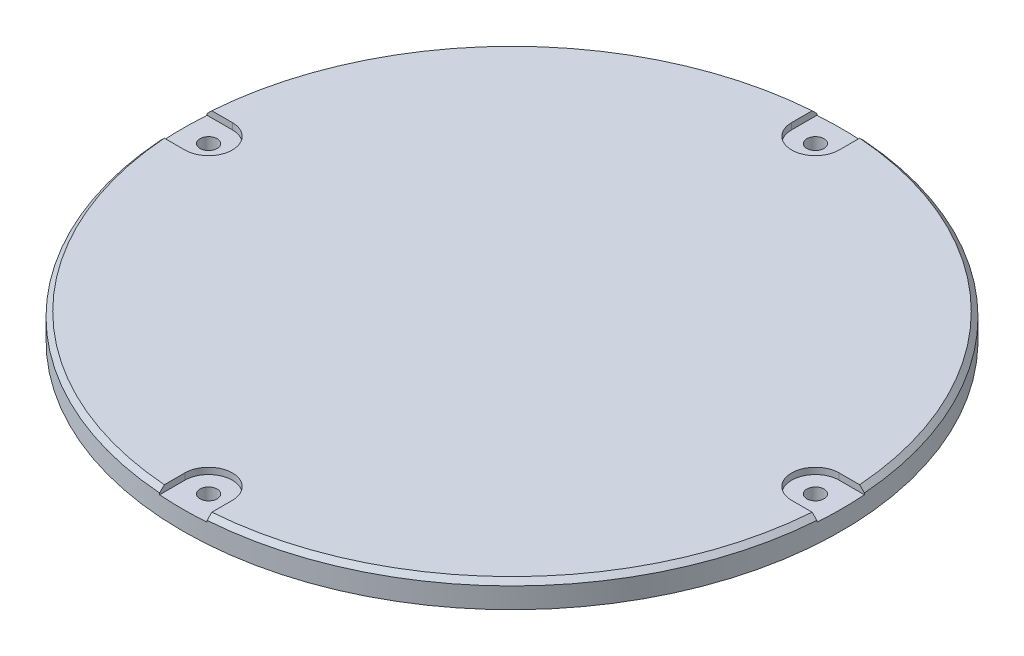
ISO-10303-21;
HEADER;
FILE_DESCRIPTION(('STEP AP214'),'2;1');
FILE_NAME('part.step','',(''),(''),'','','');
FILE_SCHEMA(('AUTOMOTIVE_DESIGN { 1 0 10303 214 1 1 1 1 }'));
ENDSEC;
DATA;
#1=APPLICATION_CONTEXT('core data for automotive mechanical design processes');
#2=APPLICATION_PROTOCOL_DEFINITION('international standard','automotive_design',2000,#1);
#3=PRODUCT_CONTEXT('',#1,'mechanical');
#4=PRODUCT('Part','Part','',(#3));
#5=PRODUCT_RELATED_PRODUCT_CATEGORY('part','',(#4));
#6=PRODUCT_DEFINITION_FORMATION('','',#4);
#7=PRODUCT_DEFINITION_CONTEXT('part definition',#1,'design');
#8=PRODUCT_DEFINITION('design','',#6,#7);
#9=PRODUCT_DEFINITION_SHAPE('','',#8);
#10=(LENGTH_UNIT() NAMED_UNIT(*) SI_UNIT(.MILLI.,.METRE.));
#11=(NAMED_UNIT(*) PLANE_ANGLE_UNIT() SI_UNIT($,.RADIAN.));
#12=(NAMED_UNIT(*) SI_UNIT($,.STERADIAN.) SOLID_ANGLE_UNIT());
#13=UNCERTAINTY_MEASURE_WITH_UNIT(LENGTH_MEASURE(1.E-05),#10,'distance_accuracy_value','');
#14=(GEOMETRIC_REPRESENTATION_CONTEXT(3) GLOBAL_UNCERTAINTY_ASSIGNED_CONTEXT((#13)) GLOBAL_UNIT_ASSIGNED_CONTEXT((#10,
#11,#12)) REPRESENTATION_CONTEXT('',''));
#15=CARTESIAN_POINT('',(0.,0.,0.));
#16=DIRECTION('',(0.,0.,1.));
#17=DIRECTION('',(1.,0.,0.));
#18=AXIS2_PLACEMENT_3D('',#15,#16,#17);
#19=CARTESIAN_POINT('',(0.,4.,0.));
#20=DIRECTION('',(0.,-1.,0.));
#21=DIRECTION('',(0.,0.,-1.));
#22=AXIS2_PLACEMENT_3D('',#19,#20,#21);
#23=CONICAL_SURFACE('',#22,51.25,0.785398163397462);
#24=CARTESIAN_POINT('',(0.,3.25000000000002,0.));
#25=DIRECTION('',(0.,1.,0.));
#26=DIRECTION('',(0.,0.,1.));
#27=AXIS2_PLACEMENT_3D('',#24,#25,#26);
#28=CIRCLE('',#27,52.);
#29=CARTESIAN_POINT('',(3.75,3.25000000000001,-51.8646073927105));
#30=VERTEX_POINT('',#29);
#31=CARTESIAN_POINT('',(51.8646073927105,3.25000000000002,-3.74999999999982));
#32=VERTEX_POINT('',#31);
#33=EDGE_CURVE('E471',#30,#32,#28,.F.);
#34=ORIENTED_EDGE('',*,*,#33,.F.);
#35=CARTESIAN_POINT('',(3.75,-0.794982563244696,-55.9193845684519));
#36=CARTESIAN_POINT('',(3.75,-0.0573468361015232,-55.1800915932133));
#37=CARTESIAN_POINT('',(3.75,0.680256548028162,-54.4407663456519));
#38=CARTESIAN_POINT('',(3.75,2.1553890839409,-52.9620418182177));
#39=CARTESIAN_POINT('',(3.75,2.89291823572493,-52.2226425383459));
#40=CARTESIAN_POINT('',(3.75,4.36789278230882,-50.7437604368944));
#41=CARTESIAN_POINT('',(3.75,5.10533817710841,-50.0042776153145));
#42=CARTESIAN_POINT('',(3.75,6.58013285408611,-48.5252161179169));
#43=CARTESIAN_POINT('',(3.75,7.31748213626294,-47.785637442098));
#44=CARTESIAN_POINT('',(3.75,8.05477717574141,-47.0460046914869));
#45=B_SPLINE_CURVE_WITH_KNOTS('',3,(#35,#36,#37,#38,#39,#40,#41,#42,#43,#44),.UNSPECIFIED.,.F.,
.F.,(4,2,2,2,4),(0.,3.13304087556219,6.2660817099244,9.39912255397924,12.5321634392833),.UNSPECIFIED.);
#46=CARTESIAN_POINT('',(3.75,4.,-51.1126207506522));
#47=VERTEX_POINT('',#46);
#48=EDGE_CURVE('E61',#30,#47,#45,.T.);
#49=ORIENTED_EDGE('',*,*,#48,.T.);
#50=CARTESIAN_POINT('',(0.,4.,0.));
#51=DIRECTION('',(0.,1.,0.));
#52=DIRECTION('',(0.,0.,1.));
#53=AXIS2_PLACEMENT_3D('',#50,#51,#52);
#54=CIRCLE('',#53,51.25);
#55=CARTESIAN_POINT('',(51.1126207506522,4.,-3.74999999999982));
#56=VERTEX_POINT('',#55);
#57=EDGE_CURVE('E344',#56,#47,#54,.T.);
#58=ORIENTED_EDGE('',*,*,#57,.F.);
#59=CARTESIAN_POINT('',(55.9193845684519,-0.794982563244682,-3.74999999999981));
#60=CARTESIAN_POINT('',(55.1800915932133,-0.0573468361015116,-3.74999999999981));
#61=CARTESIAN_POINT('',(54.4407663456519,0.68025654802817,-3.74999999999981));
#62=CARTESIAN_POINT('',(52.9620418182177,2.1553890839409,-3.74999999999982));
#63=CARTESIAN_POINT('',(52.2226425383459,2.89291823572493,-3.74999999999982));
#64=CARTESIAN_POINT('',(50.7437604368944,4.36789278230881,-3.74999999999982));
#65=CARTESIAN_POINT('',(50.0042776153145,5.1053381771084,-3.74999999999983));
#66=CARTESIAN_POINT('',(48.5252161179169,6.5801328540861,-3.74999999999983));
#67=CARTESIAN_POINT('',(47.7856374420981,7.31748213626293,-3.74999999999983));
#68=CARTESIAN_POINT('',(47.0460046914869,8.05477717574139,-3.74999999999984));
#69=B_SPLINE_CURVE_WITH_KNOTS('',3,(#59,#60,#61,#62,#63,#64,#65,#66,#67,#68),.UNSPECIFIED.,.F.,
.F.,(4,2,2,2,4),(0.,3.13304087556218,6.26608170992438,9.39912255397921,12.5321634392833),.UNSPECIFIED.);
#70=EDGE_CURVE('E469',#32,#56,#69,.T.);
#71=ORIENTED_EDGE('',*,*,#70,.F.);
#72=EDGE_LOOP('',(#34,#49,#58,#71));
#73=FACE_BOUND('',#72,.T.);
#74=ADVANCED_FACE('F46',(#73),#23,.T.);
#75=CARTESIAN_POINT('',(-3.75,-0.794982563244682,-55.9193845684519));
#76=CARTESIAN_POINT('',(-3.75,-0.0573468361015108,-55.1800915932133));
#77=CARTESIAN_POINT('',(-3.75,0.680256548028169,-54.4407663456519));
#78=CARTESIAN_POINT('',(-3.75,2.1553890839409,-52.9620418182177));
#79=CARTESIAN_POINT('',(-3.75,2.89291823572493,-52.2226425383459));
#80=CARTESIAN_POINT('',(-3.75,4.36789278230881,-50.7437604368944));
#81=CARTESIAN_POINT('',(-3.75,5.1053381771084,-50.0042776153145));
#82=CARTESIAN_POINT('',(-3.75,6.5801328540861,-48.5252161179169));
#83=CARTESIAN_POINT('',(-3.75,7.31748213626293,-47.7856374420981));
#84=CARTESIAN_POINT('',(-3.75,8.0547771757414,-47.0460046914869));
#85=B_SPLINE_CURVE_WITH_KNOTS('',3,(#75,#76,#77,#78,#79,#80,#81,#82,#83,#84),.UNSPECIFIED.,.F.,
.F.,(4,2,2,2,4),(0.,3.13304087556217,6.26608170992438,9.39912255397921,12.5321634392833),.UNSPECIFIED.);
#86=CARTESIAN_POINT('',(-3.75,3.25000000000002,-51.8646073927105));
#87=VERTEX_POINT('',#86);
#88=CARTESIAN_POINT('',(-3.75,4.,-51.1126207506522));
#89=VERTEX_POINT('',#88);
#90=EDGE_CURVE('E11',#87,#89,#85,.T.);
#91=ORIENTED_EDGE('',*,*,#90,.F.);
#92=CARTESIAN_POINT('',(-51.8646073927105,3.25000000000002,-3.74999999999999));
#93=VERTEX_POINT('',#92);
#94=EDGE_CURVE('E349',#93,#87,#28,.F.);
#95=ORIENTED_EDGE('',*,*,#94,.F.);
#96=CARTESIAN_POINT('',(-55.9193845684519,-0.794982563244695,-3.74999999999947));
#97=CARTESIAN_POINT('',(-55.1800915932134,-0.0573468361015211,-3.74999999999956));
#98=CARTESIAN_POINT('',(-54.4407663456519,0.680256548028167,-3.74999999999966));
#99=CARTESIAN_POINT('',(-52.9620418182177,2.15538908394091,-3.74999999999985));
#100=CARTESIAN_POINT('',(-52.2226425383459,2.89291823572495,-3.74999999999994));
#101=CARTESIAN_POINT('',(-50.7437604368944,4.36789278230884,-3.75000000000013));
#102=CARTESIAN_POINT('',(-50.0042776153144,5.10533817710844,-3.75000000000023));
#103=CARTESIAN_POINT('',(-48.5252161179169,6.58013285408614,-3.75000000000042));
#104=CARTESIAN_POINT('',(-47.785637442098,7.31748213626298,-3.75000000000051));
#105=CARTESIAN_POINT('',(-47.0460046914868,8.05477717574144,-3.75000000000061));
#106=B_SPLINE_CURVE_WITH_KNOTS('',3,(#96,#97,#98,#99,#100,#101,#102,#103,#104,#105),
.UNSPECIFIED.,.F.,.F.,(4,2,2,2,4),(0.,3.13304087556221,6.26608170992445,9.39912255397933,
12.5321634392834),.UNSPECIFIED.);
#107=CARTESIAN_POINT('',(-51.1126207506522,4.,-3.75000000000009));
#108=VERTEX_POINT('',#107);
#109=EDGE_CURVE('E447',#93,#108,#106,.T.);
#110=ORIENTED_EDGE('',*,*,#109,.T.);
#111=EDGE_CURVE('E460',#89,#108,#54,.T.);
#112=ORIENTED_EDGE('',*,*,#111,.F.);
#113=EDGE_LOOP('',(#91,#95,#110,#112));
#114=FACE_BOUND('',#113,.T.);
#115=ADVANCED_FACE('F425',(#114),#23,.T.);
#116=CARTESIAN_POINT('',(51.8646073927105,3.25000000000002,3.75000000000018));
#117=VERTEX_POINT('',#116);
#118=CARTESIAN_POINT('',(3.74999999999964,3.25000000000002,51.8646073927105));
#119=VERTEX_POINT('',#118);
#120=EDGE_CURVE('E343',#117,#119,#28,.F.);
#121=ORIENTED_EDGE('',*,*,#120,.F.);
#122=CARTESIAN_POINT('',(55.9193845684519,-0.794982563244674,3.75000000000019));
#123=CARTESIAN_POINT('',(55.1800915932133,-0.0573468361015063,3.75000000000019));
#124=CARTESIAN_POINT('',(54.4407663456519,0.680256548028174,3.75000000000019));
#125=CARTESIAN_POINT('',(52.9620418182177,2.15538908394091,3.75000000000018));
#126=CARTESIAN_POINT('',(52.2226425383459,2.89291823572493,3.75000000000018));
#127=CARTESIAN_POINT('',(50.7437604368944,4.36789278230881,3.75000000000018));
#128=CARTESIAN_POINT('',(50.0042776153145,5.10533817710841,3.75000000000017));
#129=CARTESIAN_POINT('',(48.5252161179169,6.5801328540861,3.75000000000017));
#130=CARTESIAN_POINT('',(47.785637442098,7.31748213626293,3.75000000000017));
#131=CARTESIAN_POINT('',(47.0460046914869,8.0547771757414,3.75000000000016));
#132=B_SPLINE_CURVE_WITH_KNOTS('',3,(#122,#123,#124,#125,#126,#127,#128,#129,#130,#131),
.UNSPECIFIED.,.F.,.F.,(4,2,2,2,4),(0.,3.13304087556218,6.26608170992437,9.39912255397921,
12.5321634392833),.UNSPECIFIED.);
#133=CARTESIAN_POINT('',(51.1126207506522,4.,3.75000000000018));
#134=VERTEX_POINT('',#133);
#135=EDGE_CURVE('E512',#117,#134,#132,.T.);
#136=ORIENTED_EDGE('',*,*,#135,.T.);
#137=CARTESIAN_POINT('',(3.74999999999964,4.,51.1126207506522));
#138=VERTEX_POINT('',#137);
#139=EDGE_CURVE('E340',#138,#134,#54,.T.);
#140=ORIENTED_EDGE('',*,*,#139,.F.);
#141=CARTESIAN_POINT('',(3.74999999999961,-0.794982563244682,55.9193845684519));
#142=CARTESIAN_POINT('',(3.74999999999962,-0.0573468361015118,55.1800915932133));
#143=CARTESIAN_POINT('',(3.74999999999962,0.680256548028169,54.4407663456519));
#144=CARTESIAN_POINT('',(3.74999999999963,2.1553890839409,52.9620418182177));
#145=CARTESIAN_POINT('',(3.74999999999964,2.89291823572493,52.2226425383459));
#146=CARTESIAN_POINT('',(3.74999999999965,4.36789278230881,50.7437604368944));
#147=CARTESIAN_POINT('',(3.74999999999965,5.1053381771084,50.0042776153145));
#148=CARTESIAN_POINT('',(3.74999999999966,6.5801328540861,48.525216117917));
#149=CARTESIAN_POINT('',(3.74999999999967,7.31748213626293,47.7856374420981));
#150=CARTESIAN_POINT('',(3.74999999999967,8.0547771757414,47.046004691487));
#151=B_SPLINE_CURVE_WITH_KNOTS('',3,(#141,#142,#143,#144,#145,#146,#147,#148,#149,#150),
.UNSPECIFIED.,.F.,.F.,(4,2,2,2,4),(0.,3.13304087556217,6.26608170992438,9.39912255397921,
12.5321634392833),.UNSPECIFIED.);
#152=EDGE_CURVE('E356',#119,#138,#151,.T.);
#153=ORIENTED_EDGE('',*,*,#152,.F.);
#154=EDGE_LOOP('',(#121,#136,#140,#153));
#155=FACE_BOUND('',#154,.T.);
#156=ADVANCED_FACE('F419',(#155),#23,.T.);
#157=CARTESIAN_POINT('',(0.,4.,0.));
#158=DIRECTION('',(0.,-1.,0.));
#159=DIRECTION('',(0.,0.,-1.));
#160=AXIS2_PLACEMENT_3D('',#157,#158,#159);
#161=CYLINDRICAL_SURFACE('',#160,52.);
#162=ORIENTED_EDGE('',*,*,#94,.T.);
#163=DIRECTION('',(0.,1.,0.));
#164=VECTOR('',#163,1.);
#165=CARTESIAN_POINT('',(-3.75,3.,-51.8646073927105));
#166=LINE('',#165,#164);
#167=CARTESIAN_POINT('',(-3.75,3.,-51.8646073927105));
#168=VERTEX_POINT('',#167);
#169=EDGE_CURVE('E227',#168,#87,#166,.T.);
#170=ORIENTED_EDGE('',*,*,#169,.F.);
#171=CARTESIAN_POINT('',(0.,3.,0.));
#172=DIRECTION('',(0.,1.,0.));
#173=DIRECTION('',(0.,0.,1.));
#174=AXIS2_PLACEMENT_3D('',#171,#172,#173);
#175=CIRCLE('',#174,52.);
#176=CARTESIAN_POINT('',(3.75,3.,-51.8646073927105));
#177=VERTEX_POINT('',#176);
#178=EDGE_CURVE('E200',#177,#168,#175,.T.);
#179=ORIENTED_EDGE('',*,*,#178,.F.);
#180=DIRECTION('',(0.,1.,0.));
#181=VECTOR('',#180,1.);
#182=CARTESIAN_POINT('',(3.75,3.,-51.8646073927105));
#183=LINE('',#182,#181);
#184=EDGE_CURVE('E230',#177,#30,#183,.T.);
#185=ORIENTED_EDGE('',*,*,#184,.T.);
#186=ORIENTED_EDGE('',*,*,#33,.T.);
#187=DIRECTION('',(0.,1.,0.));
#188=VECTOR('',#187,1.);
#189=CARTESIAN_POINT('',(51.8646073927105,3.,-3.74999999999982));
#190=LINE('',#189,#188);
#191=CARTESIAN_POINT('',(51.8646073927105,3.,-3.74999999999982));
#192=VERTEX_POINT('',#191);
#193=EDGE_CURVE('E252',#192,#32,#190,.T.);
#194=ORIENTED_EDGE('',*,*,#193,.F.);
#195=CARTESIAN_POINT('',(0.,3.,0.));
#196=DIRECTION('',(0.,1.,0.));
#197=DIRECTION('',(0.,0.,1.));
#198=AXIS2_PLACEMENT_3D('',#195,#196,#197);
#199=CIRCLE('',#198,52.);
#200=CARTESIAN_POINT('',(51.8646073927105,3.,3.75000000000018));
#201=VERTEX_POINT('',#200);
#202=EDGE_CURVE('E276',#201,#192,#199,.T.);
#203=ORIENTED_EDGE('',*,*,#202,.F.);
#204=DIRECTION('',(0.,1.,0.));
#205=VECTOR('',#204,1.);
#206=CARTESIAN_POINT('',(51.8646073927105,3.,3.75000000000018));
#207=LINE('',#206,#205);
#208=EDGE_CURVE('E289',#201,#117,#207,.T.);
#209=ORIENTED_EDGE('',*,*,#208,.T.);
#210=ORIENTED_EDGE('',*,*,#120,.T.);
#211=DIRECTION('',(0.,1.,0.));
#212=VECTOR('',#211,1.);
#213=CARTESIAN_POINT('',(3.74999999999964,3.,51.8646073927105));
#214=LINE('',#213,#212);
#215=CARTESIAN_POINT('',(3.74999999999964,3.,51.8646073927105));
#216=VERTEX_POINT('',#215);
#217=EDGE_CURVE('E283',#216,#119,#214,.T.);
#218=ORIENTED_EDGE('',*,*,#217,.F.);
#219=CARTESIAN_POINT('',(0.,3.,0.));
#220=DIRECTION('',(0.,1.,0.));
#221=DIRECTION('',(0.,0.,1.));
#222=AXIS2_PLACEMENT_3D('',#219,#220,#221);
#223=CIRCLE('',#222,52.);
#224=CARTESIAN_POINT('',(-3.75000000000036,3.,51.8646073927105));
#225=VERTEX_POINT('',#224);
#226=EDGE_CURVE('E307',#225,#216,#223,.T.);
#227=ORIENTED_EDGE('',*,*,#226,.F.);
#228=DIRECTION('',(0.,1.,0.));
#229=VECTOR('',#228,1.);
#230=CARTESIAN_POINT('',(-3.75000000000036,3.,51.8646073927105));
#231=LINE('',#230,#229);
#232=CARTESIAN_POINT('',(-3.75000000000036,3.25000000000002,51.8646073927105));
#233=VERTEX_POINT('',#232);
#234=EDGE_CURVE('E318',#225,#233,#231,.T.);
#235=ORIENTED_EDGE('',*,*,#234,.T.);
#236=CARTESIAN_POINT('',(-51.8646073927105,3.25000000000002,3.74999999999946));
#237=VERTEX_POINT('',#236);
#238=EDGE_CURVE('E345',#233,#237,#28,.F.);
#239=ORIENTED_EDGE('',*,*,#238,.T.);
#240=DIRECTION('',(0.,1.,0.));
#241=VECTOR('',#240,1.);
#242=CARTESIAN_POINT('',(-51.8646073927105,3.,3.74999999999946));
#243=LINE('',#242,#241);
#244=CARTESIAN_POINT('',(-51.8646073927105,3.,3.74999999999946));
#245=VERTEX_POINT('',#244);
#246=EDGE_CURVE('E223',#245,#237,#243,.T.);
#247=ORIENTED_EDGE('',*,*,#246,.F.);
#248=CARTESIAN_POINT('',(0.,3.,0.));
#249=DIRECTION('',(0.,1.,0.));
#250=DIRECTION('',(0.,0.,1.));
#251=AXIS2_PLACEMENT_3D('',#248,#249,#250);
#252=CIRCLE('',#251,52.);
#253=CARTESIAN_POINT('',(-51.8646073927105,3.,-3.74999999999999));
#254=VERTEX_POINT('',#253);
#255=EDGE_CURVE('E245',#254,#245,#252,.T.);
#256=ORIENTED_EDGE('',*,*,#255,.F.);
#257=DIRECTION('',(0.,1.,0.));
#258=VECTOR('',#257,1.);
#259=CARTESIAN_POINT('',(-51.8646073927105,3.,-3.74999999999999));
#260=LINE('',#259,#258);
#261=EDGE_CURVE('E257',#254,#93,#260,.T.);
#262=ORIENTED_EDGE('',*,*,#261,.T.);
#263=EDGE_LOOP('',(#162,#170,#179,#185,#186,#194,#203,#209,#210,#218,#227,#235,#239,#247,#256,#262));
#264=FACE_BOUND('',#263,.T.);
#265=CARTESIAN_POINT('',(0.,0.,0.));
#266=DIRECTION('',(0.,1.,0.));
#267=DIRECTION('',(0.,0.,1.));
#268=AXIS2_PLACEMENT_3D('',#265,#266,#267);
#269=CIRCLE('',#268,52.);
#270=CARTESIAN_POINT('',(0.,0.,52.));
#271=VERTEX_POINT('',#270);
#272=EDGE_CURVE('E328',#271,#271,#269,.T.);
#273=ORIENTED_EDGE('',*,*,#272,.T.);
#274=EDGE_LOOP('',(#273));
#275=FACE_BOUND('',#274,.T.);
#276=ADVANCED_FACE('F414',(#264,#275),#161,.T.);
#277=CARTESIAN_POINT('',(0.,4.,0.));
#278=DIRECTION('',(0.,1.,0.));
#279=DIRECTION('',(0.,0.,1.));
#280=AXIS2_PLACEMENT_3D('',#277,#278,#279);
#281=PLANE('',#280);
#282=DIRECTION('',(0.,0.,1.));
#283=VECTOR('',#282,1.);
#284=CARTESIAN_POINT('',(-3.74999999999999,4.,0.));
#285=LINE('',#284,#283);
#286=CARTESIAN_POINT('',(-3.75,4.,-47.88));
#287=VERTEX_POINT('',#286);
#288=EDGE_CURVE('E195',#89,#287,#285,.T.);
#289=ORIENTED_EDGE('',*,*,#288,.F.);
#290=ORIENTED_EDGE('',*,*,#111,.T.);
#291=DIRECTION('',(1.,0.,-1.28538913826022E-13));
#292=VECTOR('',#291,1.);
#293=CARTESIAN_POINT('',(-4.82020926848439E-13,4.,-3.75000000000666));
#294=LINE('',#293,#292);
#295=CARTESIAN_POINT('',(-47.88,4.,-3.7500000000005));
#296=VERTEX_POINT('',#295);
#297=EDGE_CURVE('E76',#108,#296,#294,.T.);
#298=ORIENTED_EDGE('',*,*,#297,.T.);
#299=CARTESIAN_POINT('',(-47.88,4.,-5.01516379511428E-13));
#300=DIRECTION('',(0.,1.,0.));
#301=DIRECTION('',(0.,0.,1.));
#302=AXIS2_PLACEMENT_3D('',#299,#300,#301);
#303=CIRCLE('',#302,3.75);
#304=CARTESIAN_POINT('',(-47.88,4.,3.7499999999995));
#305=VERTEX_POINT('',#304);
#306=EDGE_CURVE('E251',#305,#296,#303,.T.);
#307=ORIENTED_EDGE('',*,*,#306,.F.);
#308=DIRECTION('',(1.,0.,0.));
#309=VECTOR('',#308,1.);
#310=CARTESIAN_POINT('',(0.,4.,3.74999999999999));
#311=LINE('',#310,#309);
#312=CARTESIAN_POINT('',(-51.1126207506522,4.,3.74999999999946));
#313=VERTEX_POINT('',#312);
#314=EDGE_CURVE('E249',#313,#305,#311,.T.);
#315=ORIENTED_EDGE('',*,*,#314,.F.);
#316=CARTESIAN_POINT('',(-3.75000000000036,4.,51.1126207506522));
#317=VERTEX_POINT('',#316);
#318=EDGE_CURVE('E339',#313,#317,#54,.T.);
#319=ORIENTED_EDGE('',*,*,#318,.T.);
#320=DIRECTION('',(0.,0.,-1.));
#321=VECTOR('',#320,1.);
#322=CARTESIAN_POINT('',(-3.75000000000001,4.,0.));
#323=LINE('',#322,#321);
#324=CARTESIAN_POINT('',(-3.75000000000033,4.,47.88));
#325=VERTEX_POINT('',#324);
#326=EDGE_CURVE('E68',#317,#325,#323,.T.);
#327=ORIENTED_EDGE('',*,*,#326,.T.);
#328=CARTESIAN_POINT('',(-3.34344253007619E-13,4.,47.88));
#329=DIRECTION('',(0.,1.,0.));
#330=DIRECTION('',(0.,0.,1.));
#331=AXIS2_PLACEMENT_3D('',#328,#329,#330);
#332=CIRCLE('',#331,3.75);
#333=CARTESIAN_POINT('',(3.74999999999967,4.,47.88));
#334=VERTEX_POINT('',#333);
#335=EDGE_CURVE('E313',#334,#325,#332,.T.);
#336=ORIENTED_EDGE('',*,*,#335,.F.);
#337=DIRECTION('',(0.,0.,-1.));
#338=VECTOR('',#337,1.);
#339=CARTESIAN_POINT('',(3.74999999999999,4.,0.));
#340=LINE('',#339,#338);
#341=EDGE_CURVE('E311',#138,#334,#340,.T.);
#342=ORIENTED_EDGE('',*,*,#341,.F.);
#343=ORIENTED_EDGE('',*,*,#139,.T.);
#344=DIRECTION('',(-1.,0.,0.));
#345=VECTOR('',#344,1.);
#346=CARTESIAN_POINT('',(0.,4.,3.75));
#347=LINE('',#346,#345);
#348=CARTESIAN_POINT('',(47.88,4.,3.75000000000017));
#349=VERTEX_POINT('',#348);
#350=EDGE_CURVE('E268',#134,#349,#347,.T.);
#351=ORIENTED_EDGE('',*,*,#350,.T.);
#352=CARTESIAN_POINT('',(47.88,4.,1.67172126503809E-13));
#353=DIRECTION('',(0.,1.,0.));
#354=DIRECTION('',(0.,0.,1.));
#355=AXIS2_PLACEMENT_3D('',#352,#353,#354);
#356=CIRCLE('',#355,3.75);
#357=CARTESIAN_POINT('',(47.88,4.,-3.74999999999983));
#358=VERTEX_POINT('',#357);
#359=EDGE_CURVE('E282',#358,#349,#356,.T.);
#360=ORIENTED_EDGE('',*,*,#359,.F.);
#361=DIRECTION('',(-1.,0.,0.));
#362=VECTOR('',#361,1.);
#363=CARTESIAN_POINT('',(0.,4.,-3.74999999999999));
#364=LINE('',#363,#362);
#365=EDGE_CURVE('E280',#56,#358,#364,.T.);
#366=ORIENTED_EDGE('',*,*,#365,.F.);
#367=ORIENTED_EDGE('',*,*,#57,.T.);
#368=DIRECTION('',(0.,0.,1.));
#369=VECTOR('',#368,1.);
#370=CARTESIAN_POINT('',(3.75000000000001,4.,0.));
#371=LINE('',#370,#369);
#372=CARTESIAN_POINT('',(3.75,4.,-47.88));
#373=VERTEX_POINT('',#372);
#374=EDGE_CURVE('E216',#47,#373,#371,.T.);
#375=ORIENTED_EDGE('',*,*,#374,.T.);
#376=CARTESIAN_POINT('',(0.,4.,-47.88));
#377=DIRECTION('',(0.,1.,0.));
#378=DIRECTION('',(0.,0.,1.));
#379=AXIS2_PLACEMENT_3D('',#376,#377,#378);
#380=CIRCLE('',#379,3.75);
#381=EDGE_CURVE('E222',#287,#373,#380,.T.);
#382=ORIENTED_EDGE('',*,*,#381,.F.);
#383=EDGE_LOOP('',(#289,#290,#298,#307,#315,#319,#327,#336,#342,#343,#351,#360,#366,#367,#375,#382));
#384=FACE_BOUND('',#383,.T.);
#385=ADVANCED_FACE('F410',(#384),#281,.T.);
#386=CARTESIAN_POINT('',(0.,0.,0.));
#387=DIRECTION('',(0.,1.,0.));
#388=DIRECTION('',(0.,0.,1.));
#389=AXIS2_PLACEMENT_3D('',#386,#387,#388);
#390=PLANE('',#389);
#391=ORIENTED_EDGE('',*,*,#272,.F.);
#392=EDGE_LOOP('',(#391));
#393=FACE_BOUND('',#392,.T.);
#394=ADVANCED_FACE('F413',(#393),#390,.F.);
#395=CARTESIAN_POINT('',(-55.9193845684519,-0.794982563244668,3.74999999999942));
#396=CARTESIAN_POINT('',(-55.1800915932133,-0.0573468361015,3.74999999999942));
#397=CARTESIAN_POINT('',(-54.4407663456519,0.680256548028181,3.74999999999943));
#398=CARTESIAN_POINT('',(-52.9620418182177,2.15538908394091,3.74999999999945));
#399=CARTESIAN_POINT('',(-52.2226425383459,2.89291823572494,3.74999999999945));
#400=CARTESIAN_POINT('',(-50.7437604368944,4.36789278230882,3.74999999999947));
#401=CARTESIAN_POINT('',(-50.0042776153145,5.10533817710842,3.74999999999948));
#402=CARTESIAN_POINT('',(-48.525216117917,6.5801328540861,3.74999999999949));
#403=CARTESIAN_POINT('',(-47.7856374420981,7.31748213626293,3.7499999999995));
#404=CARTESIAN_POINT('',(-47.046004691487,8.0547771757414,3.74999999999951));
#405=B_SPLINE_CURVE_WITH_KNOTS('',3,(#395,#396,#397,#398,#399,#400,#401,#402,#403,#404),
.UNSPECIFIED.,.F.,.F.,(4,2,2,2,4),(0.,3.13304087556218,6.26608170992437,9.3991225539792,
12.5321634392833),.UNSPECIFIED.);
#406=EDGE_CURVE('E443',#237,#313,#405,.T.);
#407=ORIENTED_EDGE('',*,*,#406,.F.);
#408=ORIENTED_EDGE('',*,*,#238,.F.);
#409=CARTESIAN_POINT('',(-3.75000000000039,-0.794982563244674,55.9193845684519));
#410=CARTESIAN_POINT('',(-3.75000000000038,-0.0573468361015074,55.1800915932133));
#411=CARTESIAN_POINT('',(-3.75000000000038,0.680256548028173,54.4407663456519));
#412=CARTESIAN_POINT('',(-3.75000000000037,2.15538908394091,52.9620418182177));
#413=CARTESIAN_POINT('',(-3.75000000000036,2.89291823572493,52.2226425383459));
#414=CARTESIAN_POINT('',(-3.75000000000035,4.36789278230881,50.7437604368944));
#415=CARTESIAN_POINT('',(-3.75000000000035,5.10533817710841,50.0042776153144));
#416=CARTESIAN_POINT('',(-3.75000000000034,6.5801328540861,48.5252161179169));
#417=CARTESIAN_POINT('',(-3.75000000000033,7.31748213626293,47.785637442098));
#418=CARTESIAN_POINT('',(-3.75000000000033,8.0547771757414,47.0460046914869));
#419=B_SPLINE_CURVE_WITH_KNOTS('',3,(#409,#410,#411,#412,#413,#414,#415,#416,#417,#418),
.UNSPECIFIED.,.F.,.F.,(4,2,2,2,4),(0.,3.13304087556218,6.26608170992437,9.39912255397921,
12.5321634392833),.UNSPECIFIED.);
#420=EDGE_CURVE('E348',#233,#317,#419,.T.);
#421=ORIENTED_EDGE('',*,*,#420,.T.);
#422=ORIENTED_EDGE('',*,*,#318,.F.);
#423=EDGE_LOOP('',(#407,#408,#421,#422));
#424=FACE_BOUND('',#423,.T.);
#425=ADVANCED_FACE('F49',(#424),#23,.T.);
#426=CARTESIAN_POINT('',(3.74999999999999,3.,0.));
#427=DIRECTION('',(1.,0.,0.));
#428=DIRECTION('',(0.,0.,-1.));
#429=AXIS2_PLACEMENT_3D('',#426,#427,#428);
#430=PLANE('',#429);
#431=ORIENTED_EDGE('',*,*,#152,.T.);
#432=ORIENTED_EDGE('',*,*,#341,.T.);
#433=DIRECTION('',(0.,1.,0.));
#434=VECTOR('',#433,1.);
#435=CARTESIAN_POINT('',(3.74999999999967,3.,47.88));
#436=LINE('',#435,#434);
#437=CARTESIAN_POINT('',(3.74999999999967,3.,47.88));
#438=VERTEX_POINT('',#437);
#439=EDGE_CURVE('E310',#438,#334,#436,.T.);
#440=ORIENTED_EDGE('',*,*,#439,.F.);
#441=DIRECTION('',(0.,0.,-1.));
#442=VECTOR('',#441,1.);
#443=CARTESIAN_POINT('',(3.74999999999999,3.,0.));
#444=LINE('',#443,#442);
#445=EDGE_CURVE('E299',#216,#438,#444,.T.);
#446=ORIENTED_EDGE('',*,*,#445,.F.);
#447=ORIENTED_EDGE('',*,*,#217,.T.);
#448=EDGE_LOOP('',(#431,#432,#440,#446,#447));
#449=FACE_BOUND('',#448,.T.);
#450=ADVANCED_FACE('F369',(#449),#430,.F.);
#451=CARTESIAN_POINT('',(-3.75000000000001,3.,0.));
#452=DIRECTION('',(1.,0.,0.));
#453=DIRECTION('',(0.,0.,-1.));
#454=AXIS2_PLACEMENT_3D('',#451,#452,#453);
#455=PLANE('',#454);
#456=ORIENTED_EDGE('',*,*,#234,.F.);
#457=DIRECTION('',(0.,0.,-1.));
#458=VECTOR('',#457,1.);
#459=CARTESIAN_POINT('',(-3.75000000000001,3.,0.));
#460=LINE('',#459,#458);
#461=CARTESIAN_POINT('',(-3.75000000000033,3.,47.88));
#462=VERTEX_POINT('',#461);
#463=EDGE_CURVE('E305',#225,#462,#460,.T.);
#464=ORIENTED_EDGE('',*,*,#463,.T.);
#465=DIRECTION('',(0.,1.,0.));
#466=VECTOR('',#465,1.);
#467=CARTESIAN_POINT('',(-3.75000000000033,3.,47.88));
#468=LINE('',#467,#466);
#469=EDGE_CURVE('E321',#462,#325,#468,.T.);
#470=ORIENTED_EDGE('',*,*,#469,.T.);
#471=ORIENTED_EDGE('',*,*,#326,.F.);
#472=ORIENTED_EDGE('',*,*,#420,.F.);
#473=EDGE_LOOP('',(#456,#464,#470,#471,#472));
#474=FACE_BOUND('',#473,.T.);
#475=ADVANCED_FACE('F363',(#474),#455,.T.);
#476=CARTESIAN_POINT('',(-3.34344253007619E-13,3.,47.88));
#477=DIRECTION('',(0.,1.,0.));
#478=DIRECTION('',(0.,0.,1.));
#479=AXIS2_PLACEMENT_3D('',#476,#477,#478);
#480=CYLINDRICAL_SURFACE('',#479,3.75);
#481=ORIENTED_EDGE('',*,*,#335,.T.);
#482=ORIENTED_EDGE('',*,*,#469,.F.);
#483=CARTESIAN_POINT('',(-3.34344253007619E-13,3.,47.88));
#484=DIRECTION('',(0.,1.,0.));
#485=DIRECTION('',(0.,0.,1.));
#486=AXIS2_PLACEMENT_3D('',#483,#484,#485);
#487=CIRCLE('',#486,3.75);
#488=EDGE_CURVE('E302',#438,#462,#487,.T.);
#489=ORIENTED_EDGE('',*,*,#488,.F.);
#490=ORIENTED_EDGE('',*,*,#439,.T.);
#491=EDGE_LOOP('',(#481,#482,#489,#490));
#492=FACE_BOUND('',#491,.T.);
#493=ADVANCED_FACE('F368',(#492),#480,.F.);
#494=CARTESIAN_POINT('',(0.,3.,0.));
#495=DIRECTION('',(0.,1.,0.));
#496=DIRECTION('',(0.,0.,1.));
#497=AXIS2_PLACEMENT_3D('',#494,#495,#496);
#498=PLANE('',#497);
#499=CARTESIAN_POINT('',(-3.34344253007619E-13,3.,47.88));
#500=DIRECTION('',(0.,1.,0.));
#501=DIRECTION('',(0.,0.,1.));
#502=AXIS2_PLACEMENT_3D('',#499,#500,#501);
#503=CIRCLE('',#502,1.35);
#504=CARTESIAN_POINT('',(-3.34344253007619E-13,3.,49.23));
#505=VERTEX_POINT('',#504);
#506=EDGE_CURVE('E296',#505,#505,#503,.F.);
#507=ORIENTED_EDGE('',*,*,#506,.T.);
#508=EDGE_LOOP('',(#507));
#509=FACE_BOUND('',#508,.T.);
#510=ORIENTED_EDGE('',*,*,#445,.T.);
#511=ORIENTED_EDGE('',*,*,#488,.T.);
#512=ORIENTED_EDGE('',*,*,#463,.F.);
#513=ORIENTED_EDGE('',*,*,#226,.T.);
#514=EDGE_LOOP('',(#510,#511,#512,#513));
#515=FACE_BOUND('',#514,.T.);
#516=ADVANCED_FACE('F370',(#509,#515),#498,.T.);
#517=CARTESIAN_POINT('',(0.,3.,-3.74999999999999));
#518=DIRECTION('',(0.,0.,-1.));
#519=DIRECTION('',(-1.,0.,0.));
#520=AXIS2_PLACEMENT_3D('',#517,#518,#519);
#521=PLANE('',#520);
#522=ORIENTED_EDGE('',*,*,#70,.T.);
#523=ORIENTED_EDGE('',*,*,#365,.T.);
#524=DIRECTION('',(0.,1.,0.));
#525=VECTOR('',#524,1.);
#526=CARTESIAN_POINT('',(47.88,3.,-3.74999999999983));
#527=LINE('',#526,#525);
#528=CARTESIAN_POINT('',(47.88,3.,-3.74999999999983));
#529=VERTEX_POINT('',#528);
#530=EDGE_CURVE('E279',#529,#358,#527,.T.);
#531=ORIENTED_EDGE('',*,*,#530,.F.);
#532=DIRECTION('',(-1.,0.,0.));
#533=VECTOR('',#532,1.);
#534=CARTESIAN_POINT('',(0.,3.,-3.74999999999999));
#535=LINE('',#534,#533);
#536=EDGE_CURVE('E267',#192,#529,#535,.T.);
#537=ORIENTED_EDGE('',*,*,#536,.F.);
#538=ORIENTED_EDGE('',*,*,#193,.T.);
#539=EDGE_LOOP('',(#522,#523,#531,#537,#538));
#540=FACE_BOUND('',#539,.T.);
#541=ADVANCED_FACE('F518',(#540),#521,.F.);
#542=CARTESIAN_POINT('',(0.,3.,3.75));
#543=DIRECTION('',(0.,0.,-1.));
#544=DIRECTION('',(-1.,0.,0.));
#545=AXIS2_PLACEMENT_3D('',#542,#543,#544);
#546=PLANE('',#545);
#547=ORIENTED_EDGE('',*,*,#208,.F.);
#548=DIRECTION('',(-1.,0.,0.));
#549=VECTOR('',#548,1.);
#550=CARTESIAN_POINT('',(0.,3.,3.75));
#551=LINE('',#550,#549);
#552=CARTESIAN_POINT('',(47.88,3.,3.75000000000017));
#553=VERTEX_POINT('',#552);
#554=EDGE_CURVE('E274',#201,#553,#551,.T.);
#555=ORIENTED_EDGE('',*,*,#554,.T.);
#556=DIRECTION('',(0.,1.,0.));
#557=VECTOR('',#556,1.);
#558=CARTESIAN_POINT('',(47.88,3.,3.75000000000017));
#559=LINE('',#558,#557);
#560=EDGE_CURVE('E292',#553,#349,#559,.T.);
#561=ORIENTED_EDGE('',*,*,#560,.T.);
#562=ORIENTED_EDGE('',*,*,#350,.F.);
#563=ORIENTED_EDGE('',*,*,#135,.F.);
#564=EDGE_LOOP('',(#547,#555,#561,#562,#563));
#565=FACE_BOUND('',#564,.T.);
#566=ADVANCED_FACE('F522',(#565),#546,.T.);
#567=CARTESIAN_POINT('',(47.88,3.,1.67172126503809E-13));
#568=DIRECTION('',(0.,1.,0.));
#569=DIRECTION('',(0.,0.,1.));
#570=AXIS2_PLACEMENT_3D('',#567,#568,#569);
#571=CYLINDRICAL_SURFACE('',#570,3.75);
#572=ORIENTED_EDGE('',*,*,#359,.T.);
#573=ORIENTED_EDGE('',*,*,#560,.F.);
#574=CARTESIAN_POINT('',(47.88,3.,1.67172126503809E-13));
#575=DIRECTION('',(0.,1.,0.));
#576=DIRECTION('',(0.,0.,1.));
#577=AXIS2_PLACEMENT_3D('',#574,#575,#576);
#578=CIRCLE('',#577,3.75);
#579=EDGE_CURVE('E271',#529,#553,#578,.T.);
#580=ORIENTED_EDGE('',*,*,#579,.F.);
#581=ORIENTED_EDGE('',*,*,#530,.T.);
#582=EDGE_LOOP('',(#572,#573,#580,#581));
#583=FACE_BOUND('',#582,.T.);
#584=ADVANCED_FACE('F524',(#583),#571,.F.);
#585=CARTESIAN_POINT('',(0.,3.,0.));
#586=DIRECTION('',(0.,1.,0.));
#587=DIRECTION('',(0.,0.,1.));
#588=AXIS2_PLACEMENT_3D('',#585,#586,#587);
#589=PLANE('',#588);
#590=CARTESIAN_POINT('',(47.88,3.,1.67172126503809E-13));
#591=DIRECTION('',(0.,1.,0.));
#592=DIRECTION('',(0.,0.,1.));
#593=AXIS2_PLACEMENT_3D('',#590,#591,#592);
#594=CIRCLE('',#593,1.34999999999999);
#595=CARTESIAN_POINT('',(47.88,3.,1.35000000000016));
#596=VERTEX_POINT('',#595);
#597=EDGE_CURVE('E264',#596,#596,#594,.F.);
#598=ORIENTED_EDGE('',*,*,#597,.T.);
#599=EDGE_LOOP('',(#598));
#600=FACE_BOUND('',#599,.T.);
#601=ORIENTED_EDGE('',*,*,#536,.T.);
#602=ORIENTED_EDGE('',*,*,#579,.T.);
#603=ORIENTED_EDGE('',*,*,#554,.F.);
#604=ORIENTED_EDGE('',*,*,#202,.T.);
#605=EDGE_LOOP('',(#601,#602,#603,#604));
#606=FACE_BOUND('',#605,.T.);
#607=ADVANCED_FACE('F526',(#600,#606),#589,.T.);
#608=CARTESIAN_POINT('',(0.,3.,3.74999999999999));
#609=DIRECTION('',(0.,0.,1.));
#610=DIRECTION('',(1.,0.,0.));
#611=AXIS2_PLACEMENT_3D('',#608,#609,#610);
#612=PLANE('',#611);
#613=ORIENTED_EDGE('',*,*,#406,.T.);
#614=ORIENTED_EDGE('',*,*,#314,.T.);
#615=DIRECTION('',(0.,1.,0.));
#616=VECTOR('',#615,1.);
#617=CARTESIAN_POINT('',(-47.88,3.,3.7499999999995));
#618=LINE('',#617,#616);
#619=CARTESIAN_POINT('',(-47.88,3.,3.7499999999995));
#620=VERTEX_POINT('',#619);
#621=EDGE_CURVE('E248',#620,#305,#618,.T.);
#622=ORIENTED_EDGE('',*,*,#621,.F.);
#623=DIRECTION('',(1.,0.,0.));
#624=VECTOR('',#623,1.);
#625=CARTESIAN_POINT('',(0.,3.,3.74999999999999));
#626=LINE('',#625,#624);
#627=EDGE_CURVE('E237',#245,#620,#626,.T.);
#628=ORIENTED_EDGE('',*,*,#627,.F.);
#629=ORIENTED_EDGE('',*,*,#246,.T.);
#630=EDGE_LOOP('',(#613,#614,#622,#628,#629));
#631=FACE_BOUND('',#630,.T.);
#632=ADVANCED_FACE('F502',(#631),#612,.F.);
#633=CARTESIAN_POINT('',(-4.82020926848439E-13,3.,-3.75000000000666));
#634=DIRECTION('',(1.28538913826022E-13,0.,1.));
#635=DIRECTION('',(1.,0.,-1.28538913826022E-13));
#636=AXIS2_PLACEMENT_3D('',#633,#634,#635);
#637=PLANE('',#636);
#638=ORIENTED_EDGE('',*,*,#261,.F.);
#639=DIRECTION('',(1.,0.,-1.28538913826022E-13));
#640=VECTOR('',#639,1.);
#641=CARTESIAN_POINT('',(-4.82020926848439E-13,3.,-3.75000000000666));
#642=LINE('',#641,#640);
#643=CARTESIAN_POINT('',(-47.88,3.,-3.7500000000005));
#644=VERTEX_POINT('',#643);
#645=EDGE_CURVE('E243',#254,#644,#642,.T.);
#646=ORIENTED_EDGE('',*,*,#645,.T.);
#647=DIRECTION('',(0.,1.,0.));
#648=VECTOR('',#647,1.);
#649=CARTESIAN_POINT('',(-47.88,3.,-3.7500000000005));
#650=LINE('',#649,#648);
#651=EDGE_CURVE('E260',#644,#296,#650,.T.);
#652=ORIENTED_EDGE('',*,*,#651,.T.);
#653=ORIENTED_EDGE('',*,*,#297,.F.);
#654=ORIENTED_EDGE('',*,*,#109,.F.);
#655=EDGE_LOOP('',(#638,#646,#652,#653,#654));
#656=FACE_BOUND('',#655,.T.);
#657=ADVANCED_FACE('F498',(#656),#637,.T.);
#658=CARTESIAN_POINT('',(-47.88,3.,-5.01516379511428E-13));
#659=DIRECTION('',(0.,1.,0.));
#660=DIRECTION('',(0.,0.,1.));
#661=AXIS2_PLACEMENT_3D('',#658,#659,#660);
#662=CYLINDRICAL_SURFACE('',#661,3.75);
#663=ORIENTED_EDGE('',*,*,#306,.T.);
#664=ORIENTED_EDGE('',*,*,#651,.F.);
#665=CARTESIAN_POINT('',(-47.88,3.,-5.01516379511428E-13));
#666=DIRECTION('',(0.,1.,0.));
#667=DIRECTION('',(0.,0.,1.));
#668=AXIS2_PLACEMENT_3D('',#665,#666,#667);
#669=CIRCLE('',#668,3.75);
#670=EDGE_CURVE('E240',#620,#644,#669,.T.);
#671=ORIENTED_EDGE('',*,*,#670,.F.);
#672=ORIENTED_EDGE('',*,*,#621,.T.);
#673=EDGE_LOOP('',(#663,#664,#671,#672));
#674=FACE_BOUND('',#673,.T.);
#675=ADVANCED_FACE('F496',(#674),#662,.F.);
#676=CARTESIAN_POINT('',(0.,3.,0.));
#677=DIRECTION('',(0.,1.,0.));
#678=DIRECTION('',(0.,0.,1.));
#679=AXIS2_PLACEMENT_3D('',#676,#677,#678);
#680=PLANE('',#679);
#681=CARTESIAN_POINT('',(-47.88,3.,-5.01516379511428E-13));
#682=DIRECTION('',(0.,1.,0.));
#683=DIRECTION('',(0.,0.,1.));
#684=AXIS2_PLACEMENT_3D('',#681,#682,#683);
#685=CIRCLE('',#684,1.35);
#686=CARTESIAN_POINT('',(-47.88,3.,1.34999999999949));
#687=VERTEX_POINT('',#686);
#688=EDGE_CURVE('E234',#687,#687,#685,.F.);
#689=ORIENTED_EDGE('',*,*,#688,.T.);
#690=EDGE_LOOP('',(#689));
#691=FACE_BOUND('',#690,.T.);
#692=ORIENTED_EDGE('',*,*,#627,.T.);
#693=ORIENTED_EDGE('',*,*,#670,.T.);
#694=ORIENTED_EDGE('',*,*,#645,.F.);
#695=ORIENTED_EDGE('',*,*,#255,.T.);
#696=EDGE_LOOP('',(#692,#693,#694,#695));
#697=FACE_BOUND('',#696,.T.);
#698=ADVANCED_FACE('F493',(#691,#697),#680,.T.);
#699=CARTESIAN_POINT('',(-3.74999999999999,3.,0.));
#700=DIRECTION('',(-1.,0.,0.));
#701=DIRECTION('',(0.,0.,1.));
#702=AXIS2_PLACEMENT_3D('',#699,#700,#701);
#703=PLANE('',#702);
#704=ORIENTED_EDGE('',*,*,#90,.T.);
#705=ORIENTED_EDGE('',*,*,#288,.T.);
#706=DIRECTION('',(0.,1.,0.));
#707=VECTOR('',#706,1.);
#708=CARTESIAN_POINT('',(-3.75,3.,-47.88));
#709=LINE('',#708,#707);
#710=CARTESIAN_POINT('',(-3.75,3.,-47.88));
#711=VERTEX_POINT('',#710);
#712=EDGE_CURVE('E188',#711,#287,#709,.T.);
#713=ORIENTED_EDGE('',*,*,#712,.F.);
#714=DIRECTION('',(0.,0.,1.));
#715=VECTOR('',#714,1.);
#716=CARTESIAN_POINT('',(-3.74999999999999,3.,0.));
#717=LINE('',#716,#715);
#718=EDGE_CURVE('E192',#168,#711,#717,.T.);
#719=ORIENTED_EDGE('',*,*,#718,.F.);
#720=ORIENTED_EDGE('',*,*,#169,.T.);
#721=EDGE_LOOP('',(#704,#705,#713,#719,#720));
#722=FACE_BOUND('',#721,.T.);
#723=ADVANCED_FACE('F190',(#722),#703,.F.);
#724=CARTESIAN_POINT('',(3.75000000000001,3.,0.));
#725=DIRECTION('',(-1.,0.,0.));
#726=DIRECTION('',(0.,0.,1.));
#727=AXIS2_PLACEMENT_3D('',#724,#725,#726);
#728=PLANE('',#727);
#729=ORIENTED_EDGE('',*,*,#184,.F.);
#730=DIRECTION('',(0.,0.,1.));
#731=VECTOR('',#730,1.);
#732=CARTESIAN_POINT('',(3.75000000000001,3.,0.));
#733=LINE('',#732,#731);
#734=CARTESIAN_POINT('',(3.75,3.,-47.88));
#735=VERTEX_POINT('',#734);
#736=EDGE_CURVE('E208',#177,#735,#733,.T.);
#737=ORIENTED_EDGE('',*,*,#736,.T.);
#738=DIRECTION('',(0.,1.,0.));
#739=VECTOR('',#738,1.);
#740=CARTESIAN_POINT('',(3.75,3.,-47.88));
#741=LINE('',#740,#739);
#742=EDGE_CURVE('E199',#735,#373,#741,.T.);
#743=ORIENTED_EDGE('',*,*,#742,.T.);
#744=ORIENTED_EDGE('',*,*,#374,.F.);
#745=ORIENTED_EDGE('',*,*,#48,.F.);
#746=EDGE_LOOP('',(#729,#737,#743,#744,#745));
#747=FACE_BOUND('',#746,.T.);
#748=ADVANCED_FACE('F484',(#747),#728,.T.);
#749=CARTESIAN_POINT('',(0.,3.,-47.88));
#750=DIRECTION('',(0.,1.,0.));
#751=DIRECTION('',(0.,0.,1.));
#752=AXIS2_PLACEMENT_3D('',#749,#750,#751);
#753=CYLINDRICAL_SURFACE('',#752,3.75);
#754=ORIENTED_EDGE('',*,*,#381,.T.);
#755=ORIENTED_EDGE('',*,*,#742,.F.);
#756=CARTESIAN_POINT('',(0.,3.,-47.88));
#757=DIRECTION('',(0.,1.,0.));
#758=DIRECTION('',(0.,0.,1.));
#759=AXIS2_PLACEMENT_3D('',#756,#757,#758);
#760=CIRCLE('',#759,3.75);
#761=EDGE_CURVE('E204',#711,#735,#760,.T.);
#762=ORIENTED_EDGE('',*,*,#761,.F.);
#763=ORIENTED_EDGE('',*,*,#712,.T.);
#764=EDGE_LOOP('',(#754,#755,#762,#763));
#765=FACE_BOUND('',#764,.T.);
#766=ADVANCED_FACE('F205',(#765),#753,.F.);
#767=CARTESIAN_POINT('',(0.,3.,0.));
#768=DIRECTION('',(0.,1.,0.));
#769=DIRECTION('',(0.,0.,1.));
#770=AXIS2_PLACEMENT_3D('',#767,#768,#769);
#771=PLANE('',#770);
#772=CARTESIAN_POINT('',(0.,3.,-47.88));
#773=DIRECTION('',(0.,1.,0.));
#774=DIRECTION('',(0.,0.,1.));
#775=AXIS2_PLACEMENT_3D('',#772,#773,#774);
#776=CIRCLE('',#775,1.35);
#777=CARTESIAN_POINT('',(0.,3.,-46.53));
#778=VERTEX_POINT('',#777);
#779=EDGE_CURVE('E213',#778,#778,#776,.F.);
#780=ORIENTED_EDGE('',*,*,#779,.T.);
#781=EDGE_LOOP('',(#780));
#782=FACE_BOUND('',#781,.T.);
#783=ORIENTED_EDGE('',*,*,#718,.T.);
#784=ORIENTED_EDGE('',*,*,#761,.T.);
#785=ORIENTED_EDGE('',*,*,#736,.F.);
#786=ORIENTED_EDGE('',*,*,#178,.T.);
#787=EDGE_LOOP('',(#783,#784,#785,#786));
#788=FACE_BOUND('',#787,.T.);
#789=ADVANCED_FACE('F210',(#782,#788),#771,.T.);
#790=CARTESIAN_POINT('',(0.,1.,-47.88));
#791=DIRECTION('',(0.,1.,0.));
#792=DIRECTION('',(0.,0.,1.));
#793=AXIS2_PLACEMENT_3D('',#790,#791,#792);
#794=PLANE('',#793);
#795=CARTESIAN_POINT('',(0.,1.,-47.88));
#796=DIRECTION('',(0.,1.,0.));
#797=DIRECTION('',(0.,0.,1.));
#798=AXIS2_PLACEMENT_3D('',#795,#796,#797);
#799=CIRCLE('',#798,1.35);
#800=CARTESIAN_POINT('',(0.,1.,-46.53));
#801=VERTEX_POINT('',#800);
#802=EDGE_CURVE('E325',#801,#801,#799,.T.);
#803=ORIENTED_EDGE('',*,*,#802,.T.);
#804=EDGE_LOOP('',(#803));
#805=FACE_BOUND('',#804,.T.);
#806=ADVANCED_FACE('F378',(#805),#794,.T.);
#807=CARTESIAN_POINT('',(0.,1.,-47.88));
#808=DIRECTION('',(0.,1.,0.));
#809=DIRECTION('',(0.,0.,1.));
#810=AXIS2_PLACEMENT_3D('',#807,#808,#809);
#811=CYLINDRICAL_SURFACE('',#810,1.35);
#812=ORIENTED_EDGE('',*,*,#802,.F.);
#813=EDGE_LOOP('',(#812));
#814=FACE_BOUND('',#813,.T.);
#815=ORIENTED_EDGE('',*,*,#779,.F.);
#816=EDGE_LOOP('',(#815));
#817=FACE_BOUND('',#816,.T.);
#818=ADVANCED_FACE('F381',(#814,#817),#811,.F.);
#819=CARTESIAN_POINT('',(47.88,1.,1.67172126503809E-13));
#820=DIRECTION('',(0.,1.,0.));
#821=DIRECTION('',(0.,0.,1.));
#822=AXIS2_PLACEMENT_3D('',#819,#820,#821);
#823=PLANE('',#822);
#824=CARTESIAN_POINT('',(47.88,1.,1.67172126503809E-13));
#825=DIRECTION('',(0.,1.,0.));
#826=DIRECTION('',(0.,0.,1.));
#827=AXIS2_PLACEMENT_3D('',#824,#825,#826);
#828=CIRCLE('',#827,1.34999999999999);
#829=CARTESIAN_POINT('',(47.88,1.,1.35000000000016));
#830=VERTEX_POINT('',#829);
#831=EDGE_CURVE('E329',#830,#830,#828,.T.);
#832=ORIENTED_EDGE('',*,*,#831,.T.);
#833=EDGE_LOOP('',(#832));
#834=FACE_BOUND('',#833,.T.);
#835=ADVANCED_FACE('F385',(#834),#823,.T.);
#836=CARTESIAN_POINT('',(47.88,1.,1.67172126503809E-13));
#837=DIRECTION('',(0.,1.,0.));
#838=DIRECTION('',(0.,0.,1.));
#839=AXIS2_PLACEMENT_3D('',#836,#837,#838);
#840=CYLINDRICAL_SURFACE('',#839,1.34999999999999);
#841=ORIENTED_EDGE('',*,*,#831,.F.);
#842=EDGE_LOOP('',(#841));
#843=FACE_BOUND('',#842,.T.);
#844=ORIENTED_EDGE('',*,*,#597,.F.);
#845=EDGE_LOOP('',(#844));
#846=FACE_BOUND('',#845,.T.);
#847=ADVANCED_FACE('F387',(#843,#846),#840,.F.);
#848=CARTESIAN_POINT('',(-3.34344253007619E-13,1.,47.88));
#849=DIRECTION('',(0.,1.,0.));
#850=DIRECTION('',(0.,0.,1.));
#851=AXIS2_PLACEMENT_3D('',#848,#849,#850);
#852=PLANE('',#851);
#853=CARTESIAN_POINT('',(-3.34344253007619E-13,1.,47.88));
#854=DIRECTION('',(0.,1.,0.));
#855=DIRECTION('',(0.,0.,1.));
#856=AXIS2_PLACEMENT_3D('',#853,#854,#855);
#857=CIRCLE('',#856,1.35);
#858=CARTESIAN_POINT('',(-3.34344253007619E-13,1.,49.23));
#859=VERTEX_POINT('',#858);
#860=EDGE_CURVE('E332',#859,#859,#857,.T.);
#861=ORIENTED_EDGE('',*,*,#860,.T.);
#862=EDGE_LOOP('',(#861));
#863=FACE_BOUND('',#862,.T.);
#864=ADVANCED_FACE('F390',(#863),#852,.T.);
#865=CARTESIAN_POINT('',(-3.34344253007619E-13,1.,47.88));
#866=DIRECTION('',(0.,1.,0.));
#867=DIRECTION('',(0.,0.,1.));
#868=AXIS2_PLACEMENT_3D('',#865,#866,#867);
#869=CYLINDRICAL_SURFACE('',#868,1.35);
#870=ORIENTED_EDGE('',*,*,#860,.F.);
#871=EDGE_LOOP('',(#870));
#872=FACE_BOUND('',#871,.T.);
#873=ORIENTED_EDGE('',*,*,#506,.F.);
#874=EDGE_LOOP('',(#873));
#875=FACE_BOUND('',#874,.T.);
#876=ADVANCED_FACE('F395',(#872,#875),#869,.F.);
#877=CARTESIAN_POINT('',(-47.88,1.,-5.01516379511428E-13));
#878=DIRECTION('',(0.,1.,0.));
#879=DIRECTION('',(0.,0.,1.));
#880=AXIS2_PLACEMENT_3D('',#877,#878,#879);
#881=PLANE('',#880);
#882=CARTESIAN_POINT('',(-47.88,1.,-5.01516379511428E-13));
#883=DIRECTION('',(0.,1.,0.));
#884=DIRECTION('',(0.,0.,1.));
#885=AXIS2_PLACEMENT_3D('',#882,#883,#884);
#886=CIRCLE('',#885,1.35);
#887=CARTESIAN_POINT('',(-47.88,1.,1.34999999999949));
#888=VERTEX_POINT('',#887);
#889=EDGE_CURVE('E229',#888,#888,#886,.T.);
#890=ORIENTED_EDGE('',*,*,#889,.T.);
#891=EDGE_LOOP('',(#890));
#892=FACE_BOUND('',#891,.T.);
#893=ADVANCED_FACE('F398',(#892),#881,.T.);
#894=CARTESIAN_POINT('',(-47.88,1.,-5.01516379511428E-13));
#895=DIRECTION('',(0.,1.,0.));
#896=DIRECTION('',(0.,0.,1.));
#897=AXIS2_PLACEMENT_3D('',#894,#895,#896);
#898=CYLINDRICAL_SURFACE('',#897,1.35);
#899=ORIENTED_EDGE('',*,*,#889,.F.);
#900=EDGE_LOOP('',(#899));
#901=FACE_BOUND('',#900,.T.);
#902=ORIENTED_EDGE('',*,*,#688,.F.);
#903=EDGE_LOOP('',(#902));
#904=FACE_BOUND('',#903,.T.);
#905=ADVANCED_FACE('F403',(#901,#904),#898,.F.);
#906=CLOSED_SHELL('',(#74,#115,#156,#276,#385,#394,#425,#450,#475,#493,#516,#541,#566,#584,#607,
#632,#657,#675,#698,#723,#748,#766,#789,#806,#818,#835,#847,#864,#876,#893,#905));
#907=MANIFOLD_SOLID_BREP('B2',#906);
#908=ADVANCED_BREP_SHAPE_REPRESENTATION('',(#18,#907),#14);
#909=SHAPE_DEFINITION_REPRESENTATION(#9,#908);
ENDSEC;
END-ISO-10303-21;
